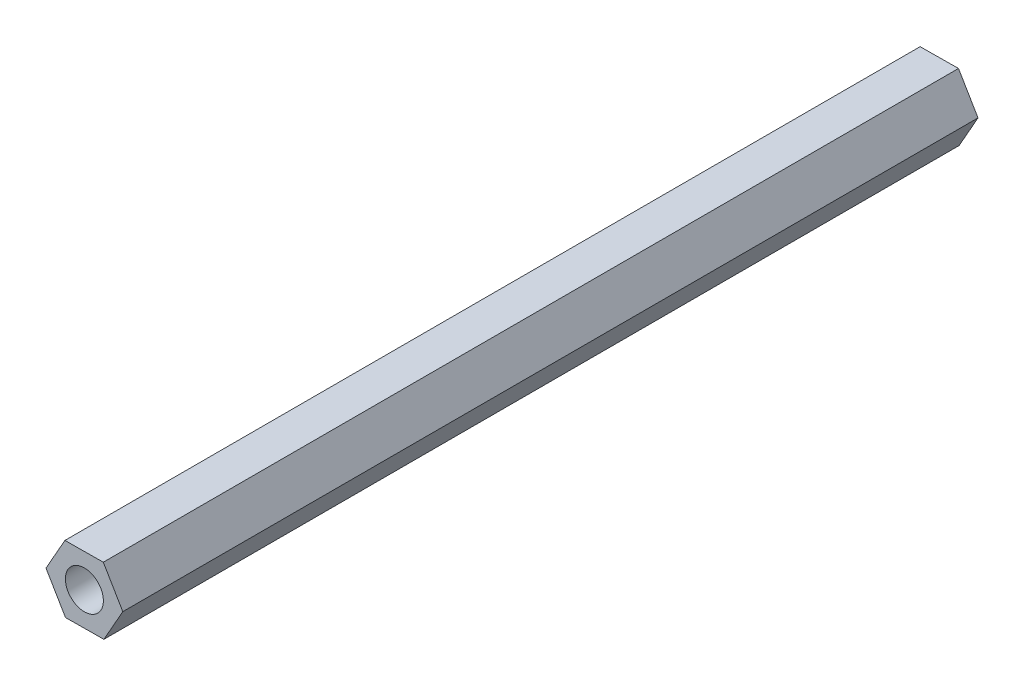
ISO-10303-21;
HEADER;
FILE_DESCRIPTION(('STEP AP214'),'2;1');
FILE_NAME('part.step','',(''),(''),'','','');
FILE_SCHEMA(('AUTOMOTIVE_DESIGN { 1 0 10303 214 1 1 1 1 }'));
ENDSEC;
DATA;
#1=APPLICATION_CONTEXT('core data for automotive mechanical design processes');
#2=APPLICATION_PROTOCOL_DEFINITION('international standard','automotive_design',2000,#1);
#3=PRODUCT_CONTEXT('',#1,'mechanical');
#4=PRODUCT('Part','Part','',(#3));
#5=PRODUCT_RELATED_PRODUCT_CATEGORY('part','',(#4));
#6=PRODUCT_DEFINITION_FORMATION('','',#4);
#7=PRODUCT_DEFINITION_CONTEXT('part definition',#1,'design');
#8=PRODUCT_DEFINITION('design','',#6,#7);
#9=PRODUCT_DEFINITION_SHAPE('','',#8);
#10=(LENGTH_UNIT() NAMED_UNIT(*) SI_UNIT(.MILLI.,.METRE.));
#11=(NAMED_UNIT(*) PLANE_ANGLE_UNIT() SI_UNIT($,.RADIAN.));
#12=(NAMED_UNIT(*) SI_UNIT($,.STERADIAN.) SOLID_ANGLE_UNIT());
#13=UNCERTAINTY_MEASURE_WITH_UNIT(LENGTH_MEASURE(1.E-05),#10,'distance_accuracy_value','');
#14=(GEOMETRIC_REPRESENTATION_CONTEXT(3) GLOBAL_UNCERTAINTY_ASSIGNED_CONTEXT((#13)) GLOBAL_UNIT_ASSIGNED_CONTEXT((#10,
#11,#12)) REPRESENTATION_CONTEXT('',''));
#15=CARTESIAN_POINT('',(0.,0.,0.));
#16=DIRECTION('',(0.,0.,1.));
#17=DIRECTION('',(1.,0.,0.));
#18=AXIS2_PLACEMENT_3D('',#15,#16,#17);
#19=CARTESIAN_POINT('',(0.,0.,90.));
#20=DIRECTION('',(0.,0.,1.));
#21=DIRECTION('',(1.,0.,0.));
#22=AXIS2_PLACEMENT_3D('',#19,#20,#21);
#23=PLANE('',#22);
#24=DIRECTION('',(0.999961257640527,0.00880245522430722,0.));
#25=VECTOR('',#24,1.);
#26=CARTESIAN_POINT('',(-1.98983906118775,-3.51765175136834,90.));
#27=LINE('',#26,#25);
#28=CARTESIAN_POINT('',(-1.98983906118775,-3.51765175136834,90.));
#29=VERTEX_POINT('',#28);
#30=CARTESIAN_POINT('',(2.05145624775792,-3.48207705211536,90.));
#31=VERTEX_POINT('',#30);
#32=EDGE_CURVE('E131',#29,#31,#27,.T.);
#33=ORIENTED_EDGE('',*,*,#32,.T.);
#34=DIRECTION('',(0.492357478980338,0.870393079529086,0.));
#35=VECTOR('',#34,1.);
#36=CARTESIAN_POINT('',(2.05145624775792,-3.48207705211536,90.));
#37=LINE('',#36,#35);
#38=CARTESIAN_POINT('',(4.04129530894568,0.0355746992529791,90.));
#39=VERTEX_POINT('',#38);
#40=EDGE_CURVE('E89',#31,#39,#37,.T.);
#41=ORIENTED_EDGE('',*,*,#40,.T.);
#42=DIRECTION('',(-0.507603778660189,0.861590624304779,0.));
#43=VECTOR('',#42,1.);
#44=CARTESIAN_POINT('',(4.04129530894568,0.0355746992529791,90.));
#45=LINE('',#44,#43);
#46=CARTESIAN_POINT('',(1.98983906118776,3.51765175136834,90.));
#47=VERTEX_POINT('',#46);
#48=EDGE_CURVE('E102',#39,#47,#45,.T.);
#49=ORIENTED_EDGE('',*,*,#48,.T.);
#50=DIRECTION('',(-0.999961257640527,-0.00880245522430723,0.));
#51=VECTOR('',#50,1.);
#52=CARTESIAN_POINT('',(1.98983906118776,3.51765175136834,90.));
#53=LINE('',#52,#51);
#54=CARTESIAN_POINT('',(-2.05145624775791,3.48207705211536,90.));
#55=VERTEX_POINT('',#54);
#56=EDGE_CURVE('E96',#47,#55,#53,.T.);
#57=ORIENTED_EDGE('',*,*,#56,.T.);
#58=DIRECTION('',(-0.492357478980338,-0.870393079529086,0.));
#59=VECTOR('',#58,1.);
#60=CARTESIAN_POINT('',(-2.05145624775791,3.48207705211536,90.));
#61=LINE('',#60,#59);
#62=CARTESIAN_POINT('',(-4.04129530894568,-0.0355746992529825,90.));
#63=VERTEX_POINT('',#62);
#64=EDGE_CURVE('E100',#55,#63,#61,.T.);
#65=ORIENTED_EDGE('',*,*,#64,.T.);
#66=DIRECTION('',(0.507603778660189,-0.861590624304779,0.));
#67=VECTOR('',#66,1.);
#68=CARTESIAN_POINT('',(-4.04129530894568,-0.0355746992529825,90.));
#69=LINE('',#68,#67);
#70=EDGE_CURVE('E52',#63,#29,#69,.T.);
#71=ORIENTED_EDGE('',*,*,#70,.T.);
#72=EDGE_LOOP('',(#33,#41,#49,#57,#65,#71));
#73=FACE_BOUND('',#72,.T.);
#74=CARTESIAN_POINT('',(0.,0.,90.));
#75=DIRECTION('',(0.,0.,1.));
#76=DIRECTION('',(1.,0.,0.));
#77=AXIS2_PLACEMENT_3D('',#74,#75,#76);
#78=CIRCLE('',#77,2.);
#79=CARTESIAN_POINT('',(-2.,0.,90.));
#80=VERTEX_POINT('',#79);
#81=EDGE_CURVE('E124',#80,#80,#78,.T.);
#82=ORIENTED_EDGE('',*,*,#81,.F.);
#83=EDGE_LOOP('',(#82));
#84=FACE_BOUND('',#83,.T.);
#85=ADVANCED_FACE('F35',(#73,#84),#23,.T.);
#86=CARTESIAN_POINT('',(0.,0.,0.));
#87=DIRECTION('',(0.,0.,1.));
#88=DIRECTION('',(1.,0.,0.));
#89=AXIS2_PLACEMENT_3D('',#86,#87,#88);
#90=PLANE('',#89);
#91=DIRECTION('',(0.999961257640527,0.00880245522430722,0.));
#92=VECTOR('',#91,1.);
#93=CARTESIAN_POINT('',(-1.98983906118775,-3.51765175136834,0.));
#94=LINE('',#93,#92);
#95=CARTESIAN_POINT('',(-1.98983906118775,-3.51765175136834,0.));
#96=VERTEX_POINT('',#95);
#97=CARTESIAN_POINT('',(2.05145624775792,-3.48207705211536,0.));
#98=VERTEX_POINT('',#97);
#99=EDGE_CURVE('E120',#96,#98,#94,.T.);
#100=ORIENTED_EDGE('',*,*,#99,.F.);
#101=DIRECTION('',(0.507603778660189,-0.861590624304779,0.));
#102=VECTOR('',#101,1.);
#103=CARTESIAN_POINT('',(-4.04129530894568,-0.0355746992529825,0.));
#104=LINE('',#103,#102);
#105=CARTESIAN_POINT('',(-4.04129530894568,-0.0355746992529825,0.));
#106=VERTEX_POINT('',#105);
#107=EDGE_CURVE('E81',#106,#96,#104,.T.);
#108=ORIENTED_EDGE('',*,*,#107,.F.);
#109=DIRECTION('',(-0.492357478980338,-0.870393079529086,0.));
#110=VECTOR('',#109,1.);
#111=CARTESIAN_POINT('',(-2.05145624775791,3.48207705211536,0.));
#112=LINE('',#111,#110);
#113=CARTESIAN_POINT('',(-2.05145624775791,3.48207705211536,0.));
#114=VERTEX_POINT('',#113);
#115=EDGE_CURVE('E75',#114,#106,#112,.T.);
#116=ORIENTED_EDGE('',*,*,#115,.F.);
#117=DIRECTION('',(-0.999961257640527,-0.00880245522430723,0.));
#118=VECTOR('',#117,1.);
#119=CARTESIAN_POINT('',(1.98983906118776,3.51765175136834,0.));
#120=LINE('',#119,#118);
#121=CARTESIAN_POINT('',(1.98983906118776,3.51765175136834,0.));
#122=VERTEX_POINT('',#121);
#123=EDGE_CURVE('E110',#122,#114,#120,.T.);
#124=ORIENTED_EDGE('',*,*,#123,.F.);
#125=DIRECTION('',(-0.507603778660189,0.861590624304779,0.));
#126=VECTOR('',#125,1.);
#127=CARTESIAN_POINT('',(4.04129530894568,0.0355746992529791,0.));
#128=LINE('',#127,#126);
#129=CARTESIAN_POINT('',(4.04129530894568,0.0355746992529791,0.));
#130=VERTEX_POINT('',#129);
#131=EDGE_CURVE('E126',#130,#122,#128,.T.);
#132=ORIENTED_EDGE('',*,*,#131,.F.);
#133=DIRECTION('',(0.492357478980338,0.870393079529086,0.));
#134=VECTOR('',#133,1.);
#135=CARTESIAN_POINT('',(2.05145624775792,-3.48207705211536,0.));
#136=LINE('',#135,#134);
#137=EDGE_CURVE('E123',#98,#130,#136,.T.);
#138=ORIENTED_EDGE('',*,*,#137,.F.);
#139=EDGE_LOOP('',(#100,#108,#116,#124,#132,#138));
#140=FACE_BOUND('',#139,.T.);
#141=CARTESIAN_POINT('',(0.,0.,0.));
#142=DIRECTION('',(0.,0.,1.));
#143=DIRECTION('',(1.,0.,0.));
#144=AXIS2_PLACEMENT_3D('',#141,#142,#143);
#145=CIRCLE('',#144,2.);
#146=CARTESIAN_POINT('',(-2.,0.,0.));
#147=VERTEX_POINT('',#146);
#148=EDGE_CURVE('E224',#147,#147,#145,.T.);
#149=ORIENTED_EDGE('',*,*,#148,.T.);
#150=EDGE_LOOP('',(#149));
#151=FACE_BOUND('',#150,.T.);
#152=ADVANCED_FACE('F140',(#140,#151),#90,.F.);
#153=CARTESIAN_POINT('',(-1.98983906118775,-3.51765175136834,90.));
#154=DIRECTION('',(-0.00880245522430722,0.999961257640527,0.));
#155=DIRECTION('',(-0.999961257640527,-0.00880245522430722,0.));
#156=AXIS2_PLACEMENT_3D('',#153,#154,#155);
#157=PLANE('',#156);
#158=ORIENTED_EDGE('',*,*,#99,.T.);
#159=DIRECTION('',(0.,0.,-1.));
#160=VECTOR('',#159,1.);
#161=CARTESIAN_POINT('',(2.05145624775792,-3.48207705211536,90.));
#162=LINE('',#161,#160);
#163=EDGE_CURVE('E11',#31,#98,#162,.T.);
#164=ORIENTED_EDGE('',*,*,#163,.F.);
#165=ORIENTED_EDGE('',*,*,#32,.F.);
#166=DIRECTION('',(0.,0.,-1.));
#167=VECTOR('',#166,1.);
#168=CARTESIAN_POINT('',(-1.98983906118775,-3.51765175136834,90.));
#169=LINE('',#168,#167);
#170=EDGE_CURVE('E116',#29,#96,#169,.T.);
#171=ORIENTED_EDGE('',*,*,#170,.T.);
#172=EDGE_LOOP('',(#158,#164,#165,#171));
#173=FACE_BOUND('',#172,.T.);
#174=ADVANCED_FACE('F37',(#173),#157,.F.);
#175=CARTESIAN_POINT('',(2.05145624775792,-3.48207705211536,90.));
#176=DIRECTION('',(-0.870393079529086,0.492357478980338,0.));
#177=DIRECTION('',(-0.492357478980338,-0.870393079529086,0.));
#178=AXIS2_PLACEMENT_3D('',#175,#176,#177);
#179=PLANE('',#178);
#180=ORIENTED_EDGE('',*,*,#137,.T.);
#181=DIRECTION('',(0.,0.,-1.));
#182=VECTOR('',#181,1.);
#183=CARTESIAN_POINT('',(4.04129530894568,0.0355746992529791,90.));
#184=LINE('',#183,#182);
#185=EDGE_CURVE('E44',#39,#130,#184,.T.);
#186=ORIENTED_EDGE('',*,*,#185,.F.);
#187=ORIENTED_EDGE('',*,*,#40,.F.);
#188=ORIENTED_EDGE('',*,*,#163,.T.);
#189=EDGE_LOOP('',(#180,#186,#187,#188));
#190=FACE_BOUND('',#189,.T.);
#191=ADVANCED_FACE('F165',(#190),#179,.F.);
#192=CARTESIAN_POINT('',(4.04129530894568,0.0355746992529791,90.));
#193=DIRECTION('',(-0.861590624304778,-0.507603778660189,0.));
#194=DIRECTION('',(0.507603778660189,-0.861590624304779,0.));
#195=AXIS2_PLACEMENT_3D('',#192,#193,#194);
#196=PLANE('',#195);
#197=ORIENTED_EDGE('',*,*,#131,.T.);
#198=DIRECTION('',(0.,0.,-1.));
#199=VECTOR('',#198,1.);
#200=CARTESIAN_POINT('',(1.98983906118776,3.51765175136834,90.));
#201=LINE('',#200,#199);
#202=EDGE_CURVE('E111',#47,#122,#201,.T.);
#203=ORIENTED_EDGE('',*,*,#202,.F.);
#204=ORIENTED_EDGE('',*,*,#48,.F.);
#205=ORIENTED_EDGE('',*,*,#185,.T.);
#206=EDGE_LOOP('',(#197,#203,#204,#205));
#207=FACE_BOUND('',#206,.T.);
#208=ADVANCED_FACE('F137',(#207),#196,.F.);
#209=CARTESIAN_POINT('',(1.98983906118776,3.51765175136834,90.));
#210=DIRECTION('',(0.00880245522430723,-0.999961257640527,0.));
#211=DIRECTION('',(0.999961257640527,0.00880245522430723,0.));
#212=AXIS2_PLACEMENT_3D('',#209,#210,#211);
#213=PLANE('',#212);
#214=ORIENTED_EDGE('',*,*,#123,.T.);
#215=DIRECTION('',(0.,0.,-1.));
#216=VECTOR('',#215,1.);
#217=CARTESIAN_POINT('',(-2.05145624775791,3.48207705211536,90.));
#218=LINE('',#217,#216);
#219=EDGE_CURVE('E107',#55,#114,#218,.T.);
#220=ORIENTED_EDGE('',*,*,#219,.F.);
#221=ORIENTED_EDGE('',*,*,#56,.F.);
#222=ORIENTED_EDGE('',*,*,#202,.T.);
#223=EDGE_LOOP('',(#214,#220,#221,#222));
#224=FACE_BOUND('',#223,.T.);
#225=ADVANCED_FACE('F108',(#224),#213,.F.);
#226=CARTESIAN_POINT('',(-2.05145624775791,3.48207705211536,90.));
#227=DIRECTION('',(0.870393079529086,-0.492357478980338,0.));
#228=DIRECTION('',(0.492357478980338,0.870393079529086,0.));
#229=AXIS2_PLACEMENT_3D('',#226,#227,#228);
#230=PLANE('',#229);
#231=ORIENTED_EDGE('',*,*,#115,.T.);
#232=DIRECTION('',(0.,0.,-1.));
#233=VECTOR('',#232,1.);
#234=CARTESIAN_POINT('',(-4.04129530894568,-0.0355746992529825,90.));
#235=LINE('',#234,#233);
#236=EDGE_CURVE('E112',#63,#106,#235,.T.);
#237=ORIENTED_EDGE('',*,*,#236,.F.);
#238=ORIENTED_EDGE('',*,*,#64,.F.);
#239=ORIENTED_EDGE('',*,*,#219,.T.);
#240=EDGE_LOOP('',(#231,#237,#238,#239));
#241=FACE_BOUND('',#240,.T.);
#242=ADVANCED_FACE('F114',(#241),#230,.F.);
#243=CARTESIAN_POINT('',(-4.04129530894568,-0.0355746992529825,90.));
#244=DIRECTION('',(0.861590624304779,0.507603778660189,0.));
#245=DIRECTION('',(-0.507603778660189,0.861590624304779,0.));
#246=AXIS2_PLACEMENT_3D('',#243,#244,#245);
#247=PLANE('',#246);
#248=ORIENTED_EDGE('',*,*,#107,.T.);
#249=ORIENTED_EDGE('',*,*,#170,.F.);
#250=ORIENTED_EDGE('',*,*,#70,.F.);
#251=ORIENTED_EDGE('',*,*,#236,.T.);
#252=EDGE_LOOP('',(#248,#249,#250,#251));
#253=FACE_BOUND('',#252,.T.);
#254=ADVANCED_FACE('F145',(#253),#247,.F.);
#255=CARTESIAN_POINT('',(0.,0.,90.));
#256=DIRECTION('',(0.,0.,-1.));
#257=DIRECTION('',(-1.,0.,0.));
#258=AXIS2_PLACEMENT_3D('',#255,#256,#257);
#259=CYLINDRICAL_SURFACE('',#258,2.);
#260=CARTESIAN_POINT('',(-2.,0.,90.));
#261=CARTESIAN_POINT('',(-2.,0.,89.0625));
#262=CARTESIAN_POINT('',(-2.,0.,88.125));
#263=CARTESIAN_POINT('',(-2.,0.,86.25));
#264=CARTESIAN_POINT('',(-2.,0.,85.3125));
#265=CARTESIAN_POINT('',(-2.,0.,83.4375));
#266=CARTESIAN_POINT('',(-2.,0.,82.5));
#267=CARTESIAN_POINT('',(-2.,0.,80.625));
#268=CARTESIAN_POINT('',(-2.,0.,79.6875));
#269=CARTESIAN_POINT('',(-2.,0.,77.8125));
#270=CARTESIAN_POINT('',(-2.,0.,76.875));
#271=CARTESIAN_POINT('',(-2.,0.,75.));
#272=CARTESIAN_POINT('',(-2.,0.,74.0625));
#273=CARTESIAN_POINT('',(-2.,0.,72.1875));
#274=CARTESIAN_POINT('',(-2.,0.,71.25));
#275=CARTESIAN_POINT('',(-2.,0.,69.375));
#276=CARTESIAN_POINT('',(-2.,0.,68.4375));
#277=CARTESIAN_POINT('',(-2.,0.,66.5625));
#278=CARTESIAN_POINT('',(-2.,0.,65.625));
#279=CARTESIAN_POINT('',(-2.,0.,63.75));
#280=CARTESIAN_POINT('',(-2.,0.,62.8125));
#281=CARTESIAN_POINT('',(-2.,0.,60.9375));
#282=CARTESIAN_POINT('',(-2.,0.,60.));
#283=CARTESIAN_POINT('',(-2.,0.,58.125));
#284=CARTESIAN_POINT('',(-2.,0.,57.1875));
#285=CARTESIAN_POINT('',(-2.,0.,55.3125));
#286=CARTESIAN_POINT('',(-2.,0.,54.375));
#287=CARTESIAN_POINT('',(-2.,0.,52.5));
#288=CARTESIAN_POINT('',(-2.,0.,51.5625));
#289=CARTESIAN_POINT('',(-2.,0.,49.6875));
#290=CARTESIAN_POINT('',(-2.,0.,48.75));
#291=CARTESIAN_POINT('',(-2.,0.,46.875));
#292=CARTESIAN_POINT('',(-2.,0.,45.9375));
#293=CARTESIAN_POINT('',(-2.,0.,44.0625));
#294=CARTESIAN_POINT('',(-2.,0.,43.125));
#295=CARTESIAN_POINT('',(-2.,0.,41.25));
#296=CARTESIAN_POINT('',(-2.,0.,40.3125));
#297=CARTESIAN_POINT('',(-2.,0.,38.4375));
#298=CARTESIAN_POINT('',(-2.,0.,37.5));
#299=CARTESIAN_POINT('',(-2.,0.,35.625));
#300=CARTESIAN_POINT('',(-2.,0.,34.6875));
#301=CARTESIAN_POINT('',(-2.,0.,32.8125));
#302=CARTESIAN_POINT('',(-2.,0.,31.875));
#303=CARTESIAN_POINT('',(-2.,0.,30.));
#304=CARTESIAN_POINT('',(-2.,0.,29.0625));
#305=CARTESIAN_POINT('',(-2.,0.,27.1875));
#306=CARTESIAN_POINT('',(-2.,0.,26.25));
#307=CARTESIAN_POINT('',(-2.,0.,24.375));
#308=CARTESIAN_POINT('',(-2.,0.,23.4375));
#309=CARTESIAN_POINT('',(-2.,0.,21.5625));
#310=CARTESIAN_POINT('',(-2.,0.,20.625));
#311=CARTESIAN_POINT('',(-2.,0.,18.75));
#312=CARTESIAN_POINT('',(-2.,0.,17.8125));
#313=CARTESIAN_POINT('',(-2.,0.,15.9375));
#314=CARTESIAN_POINT('',(-2.,0.,15.));
#315=CARTESIAN_POINT('',(-2.,0.,13.125));
#316=CARTESIAN_POINT('',(-2.,0.,12.1875));
#317=CARTESIAN_POINT('',(-2.,0.,10.3125));
#318=CARTESIAN_POINT('',(-2.,0.,9.37499999999999));
#319=CARTESIAN_POINT('',(-2.,0.,7.49999999999999));
#320=CARTESIAN_POINT('',(-2.,0.,6.56249999999999));
#321=CARTESIAN_POINT('',(-2.,0.,4.68749999999999));
#322=CARTESIAN_POINT('',(-2.,0.,3.74999999999998));
#323=CARTESIAN_POINT('',(-2.,0.,1.87499999999998));
#324=CARTESIAN_POINT('',(-2.,0.,0.937499999999986));
#325=CARTESIAN_POINT('',(-2.,0.,0.));
#326=B_SPLINE_CURVE_WITH_KNOTS('',3,(#260,#261,#262,#263,#264,#265,#266,#267,#268,#269,#270,
#271,#272,#273,#274,#275,#276,#277,#278,#279,#280,#281,#282,#283,#284,#285,#286,#287,#288,#289,
#290,#291,#292,#293,#294,#295,#296,#297,#298,#299,#300,#301,#302,#303,#304,#305,#306,#307,#308,
#309,#310,#311,#312,#313,#314,#315,#316,#317,#318,#319,#320,#321,#322,#323,#324,#325),
.UNSPECIFIED.,.F.,.F.,(4,2,2,2,2,2,2,2,2,2,2,2,2,2,2,2,2,2,2,2,2,2,2,2,2,2,2,2,2,2,2,2,4),(0.,
2.8125,5.62499999999999,8.43749999999999,11.25,14.0625,16.875,19.6875,22.5,25.3125,28.125,
30.9375,33.75,36.5625,39.375,42.1875,45.,47.8125,50.625,53.4375,56.25,59.0625,61.875,64.6875,
67.5,70.3125,73.125,75.9375,78.75,81.5625,84.375,87.1875,90.),.UNSPECIFIED.);
#327=EDGE_CURVE('BSEAM147',#80,#147,#326,.T.);
#328=ORIENTED_EDGE('',*,*,#81,.T.);
#329=ORIENTED_EDGE('',*,*,#148,.F.);
#330=ORIENTED_EDGE('',*,*,#327,.T.);
#331=ORIENTED_EDGE('',*,*,#327,.F.);
#332=EDGE_LOOP('',(#328,#330,#329,#331));
#333=FACE_BOUND('',#332,.T.);
#334=ADVANCED_FACE('F147',(#333),#259,.F.);
#335=CLOSED_SHELL('',(#85,#152,#174,#191,#208,#225,#242,#254,#334));
#336=MANIFOLD_SOLID_BREP('B2',#335);
#337=ADVANCED_BREP_SHAPE_REPRESENTATION('',(#18,#336),#14);
#338=SHAPE_DEFINITION_REPRESENTATION(#9,#337);
ENDSEC;
END-ISO-10303-21;
